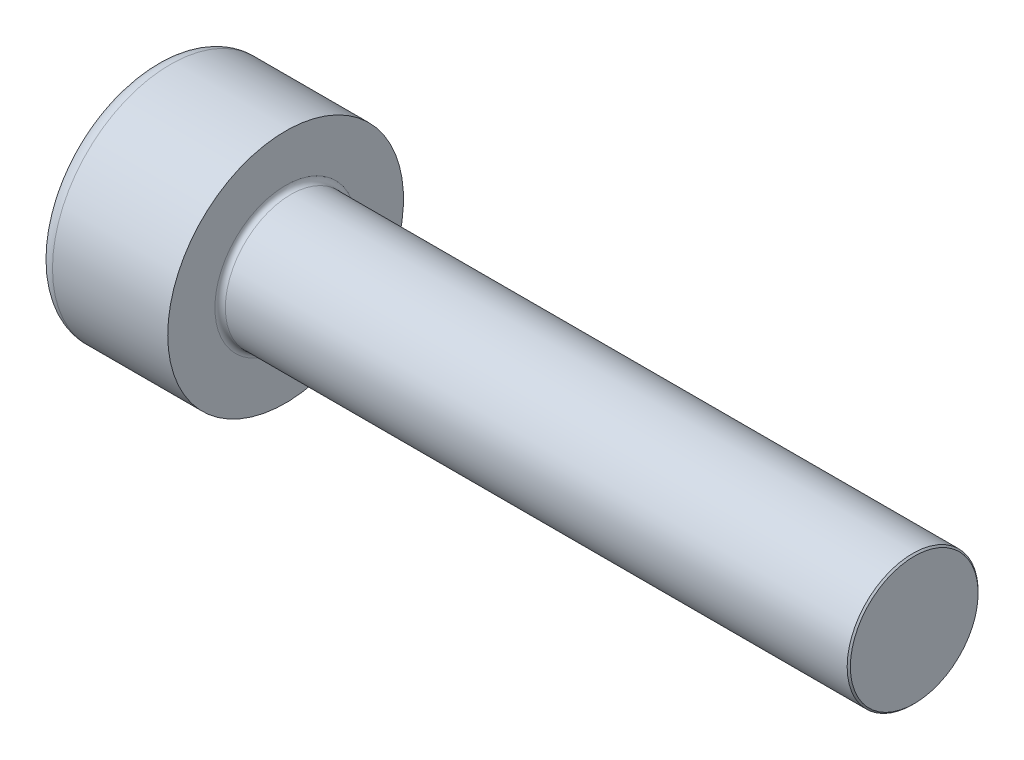
ISO-10303-21;
HEADER;
FILE_DESCRIPTION(('STEP AP214'),'2;1');
FILE_NAME('part.step','',(''),(''),'','','');
FILE_SCHEMA(('AUTOMOTIVE_DESIGN { 1 0 10303 214 1 1 1 1 }'));
ENDSEC;
DATA;
#1=APPLICATION_CONTEXT('core data for automotive mechanical design processes');
#2=APPLICATION_PROTOCOL_DEFINITION('international standard','automotive_design',2000,#1);
#3=PRODUCT_CONTEXT('',#1,'mechanical');
#4=PRODUCT('Part','Part','',(#3));
#5=PRODUCT_RELATED_PRODUCT_CATEGORY('part','',(#4));
#6=PRODUCT_DEFINITION_FORMATION('','',#4);
#7=PRODUCT_DEFINITION_CONTEXT('part definition',#1,'design');
#8=PRODUCT_DEFINITION('design','',#6,#7);
#9=PRODUCT_DEFINITION_SHAPE('','',#8);
#10=(LENGTH_UNIT() NAMED_UNIT(*) SI_UNIT(.MILLI.,.METRE.));
#11=(NAMED_UNIT(*) PLANE_ANGLE_UNIT() SI_UNIT($,.RADIAN.));
#12=(NAMED_UNIT(*) SI_UNIT($,.STERADIAN.) SOLID_ANGLE_UNIT());
#13=UNCERTAINTY_MEASURE_WITH_UNIT(LENGTH_MEASURE(1.E-05),#10,'distance_accuracy_value','');
#14=(GEOMETRIC_REPRESENTATION_CONTEXT(3) GLOBAL_UNCERTAINTY_ASSIGNED_CONTEXT((#13)) GLOBAL_UNIT_ASSIGNED_CONTEXT((#10,
#11,#12)) REPRESENTATION_CONTEXT('',''));
#15=CARTESIAN_POINT('',(0.,0.,0.));
#16=DIRECTION('',(0.,0.,1.));
#17=DIRECTION('',(1.,0.,0.));
#18=AXIS2_PLACEMENT_3D('',#15,#16,#17);
#19=CARTESIAN_POINT('',(0.,0.,0.));
#20=DIRECTION('',(-1.,0.,0.));
#21=DIRECTION('',(0.,0.,1.));
#22=AXIS2_PLACEMENT_3D('',#19,#20,#21);
#23=PLANE('',#22);
#24=DIRECTION('',(0.,-0.499999999999999,0.866025403784439));
#25=VECTOR('',#24,1.);
#26=CARTESIAN_POINT('',(0.,1.15470053837925,0.));
#27=LINE('',#26,#25);
#28=CARTESIAN_POINT('',(0.,1.15470053837925,0.));
#29=VERTEX_POINT('',#28);
#30=CARTESIAN_POINT('',(0.,0.577350269189622,0.999999999999997));
#31=VERTEX_POINT('',#30);
#32=EDGE_CURVE('E265',#29,#31,#27,.T.);
#33=ORIENTED_EDGE('',*,*,#32,.T.);
#34=DIRECTION('',(0.,1.,0.));
#35=VECTOR('',#34,1.);
#36=CARTESIAN_POINT('',(0.,-0.57735026918963,0.999999999999999));
#37=LINE('',#36,#35);
#38=CARTESIAN_POINT('',(0.,-0.57735026918963,0.999999999999999));
#39=VERTEX_POINT('',#38);
#40=EDGE_CURVE('E137',#39,#31,#37,.T.);
#41=ORIENTED_EDGE('',*,*,#40,.F.);
#42=DIRECTION('',(0.,-0.500000000000001,-0.866025403784438));
#43=VECTOR('',#42,1.);
#44=CARTESIAN_POINT('',(0.,-0.57735026918963,0.999999999999999));
#45=LINE('',#44,#43);
#46=CARTESIAN_POINT('',(0.,-1.15470053837926,0.));
#47=VERTEX_POINT('',#46);
#48=EDGE_CURVE('E268',#39,#47,#45,.T.);
#49=ORIENTED_EDGE('',*,*,#48,.T.);
#50=DIRECTION('',(0.,0.499999999999999,-0.866025403784439));
#51=VECTOR('',#50,1.);
#52=CARTESIAN_POINT('',(0.,-1.15470053837926,0.));
#53=LINE('',#52,#51);
#54=CARTESIAN_POINT('',(0.,-0.577350269189632,-1.));
#55=VERTEX_POINT('',#54);
#56=EDGE_CURVE('E271',#47,#55,#53,.T.);
#57=ORIENTED_EDGE('',*,*,#56,.T.);
#58=DIRECTION('',(0.,-1.,0.));
#59=VECTOR('',#58,1.);
#60=CARTESIAN_POINT('',(0.,0.577350269189619,-1.));
#61=LINE('',#60,#59);
#62=CARTESIAN_POINT('',(0.,0.577350269189619,-1.));
#63=VERTEX_POINT('',#62);
#64=EDGE_CURVE('E274',#63,#55,#61,.T.);
#65=ORIENTED_EDGE('',*,*,#64,.F.);
#66=DIRECTION('',(0.,-0.500000000000001,-0.866025403784438));
#67=VECTOR('',#66,1.);
#68=CARTESIAN_POINT('',(0.,1.15470053837925,0.));
#69=LINE('',#68,#67);
#70=EDGE_CURVE('E132',#29,#63,#69,.T.);
#71=ORIENTED_EDGE('',*,*,#70,.F.);
#72=EDGE_LOOP('',(#33,#41,#49,#57,#65,#71));
#73=FACE_BOUND('',#72,.T.);
#74=CARTESIAN_POINT('',(0.,0.,0.));
#75=DIRECTION('',(-1.,0.,0.));
#76=DIRECTION('',(0.,0.,1.));
#77=AXIS2_PLACEMENT_3D('',#74,#75,#76);
#78=CIRCLE('',#77,1.95);
#79=CARTESIAN_POINT('',(0.,0.,1.95));
#80=VERTEX_POINT('',#79);
#81=EDGE_CURVE('E49',#80,#80,#78,.T.);
#82=ORIENTED_EDGE('',*,*,#81,.T.);
#83=EDGE_LOOP('',(#82));
#84=FACE_BOUND('',#83,.T.);
#85=ADVANCED_FACE('F41',(#73,#84),#23,.T.);
#86=CARTESIAN_POINT('',(-31.75,0.,0.));
#87=DIRECTION('',(-1.,0.,0.));
#88=DIRECTION('',(0.,0.,1.));
#89=AXIS2_PLACEMENT_3D('',#86,#87,#88);
#90=CYLINDRICAL_SURFACE('',#89,2.25);
#91=CARTESIAN_POINT('',(0.300000000000002,0.,0.));
#92=DIRECTION('',(-1.,0.,0.));
#93=DIRECTION('',(0.,0.,1.));
#94=AXIS2_PLACEMENT_3D('',#91,#92,#93);
#95=CIRCLE('',#94,2.25);
#96=CARTESIAN_POINT('',(0.300000000000002,0.,2.25));
#97=VERTEX_POINT('',#96);
#98=EDGE_CURVE('E11',#97,#97,#95,.F.);
#99=ORIENTED_EDGE('',*,*,#98,.T.);
#100=EDGE_LOOP('',(#99));
#101=FACE_BOUND('',#100,.T.);
#102=CARTESIAN_POINT('',(2.5,0.,0.));
#103=DIRECTION('',(-1.,0.,0.));
#104=DIRECTION('',(0.,0.,1.));
#105=AXIS2_PLACEMENT_3D('',#102,#103,#104);
#106=CIRCLE('',#105,2.25);
#107=CARTESIAN_POINT('',(2.5,0.,2.25));
#108=VERTEX_POINT('',#107);
#109=EDGE_CURVE('E155',#108,#108,#106,.T.);
#110=ORIENTED_EDGE('',*,*,#109,.T.);
#111=EDGE_LOOP('',(#110));
#112=FACE_BOUND('',#111,.T.);
#113=ADVANCED_FACE('F180',(#101,#112),#90,.T.);
#114=CARTESIAN_POINT('',(2.5,2.25,0.));
#115=DIRECTION('',(1.,0.,0.));
#116=DIRECTION('',(0.,0.,-1.));
#117=AXIS2_PLACEMENT_3D('',#114,#115,#116);
#118=PLANE('',#117);
#119=CARTESIAN_POINT('',(2.5,0.,0.));
#120=DIRECTION('',(1.,0.,0.));
#121=DIRECTION('',(0.,0.,-1.));
#122=AXIS2_PLACEMENT_3D('',#119,#120,#121);
#123=CIRCLE('',#122,1.34999999999999);
#124=CARTESIAN_POINT('',(2.5,0.,-1.34999999999999));
#125=VERTEX_POINT('',#124);
#126=EDGE_CURVE('E158',#125,#125,#123,.F.);
#127=ORIENTED_EDGE('',*,*,#126,.T.);
#128=EDGE_LOOP('',(#127));
#129=FACE_BOUND('',#128,.T.);
#130=ORIENTED_EDGE('',*,*,#109,.F.);
#131=EDGE_LOOP('',(#130));
#132=FACE_BOUND('',#131,.T.);
#133=ADVANCED_FACE('F185',(#129,#132),#118,.T.);
#134=CARTESIAN_POINT('',(-31.75,0.,0.));
#135=DIRECTION('',(-1.,0.,0.));
#136=DIRECTION('',(0.,0.,1.));
#137=AXIS2_PLACEMENT_3D('',#134,#135,#136);
#138=CYLINDRICAL_SURFACE('',#137,1.24999999999999);
#139=CARTESIAN_POINT('',(2.6,0.,0.));
#140=DIRECTION('',(1.,0.,0.));
#141=DIRECTION('',(0.,0.,-1.));
#142=AXIS2_PLACEMENT_3D('',#139,#140,#141);
#143=CIRCLE('',#142,1.24999999999999);
#144=CARTESIAN_POINT('',(2.6,0.,-1.24999999999999));
#145=VERTEX_POINT('',#144);
#146=EDGE_CURVE('E161',#145,#145,#143,.T.);
#147=ORIENTED_EDGE('',*,*,#146,.T.);
#148=EDGE_LOOP('',(#147));
#149=FACE_BOUND('',#148,.T.);
#150=CARTESIAN_POINT('',(14.4695,0.,0.));
#151=DIRECTION('',(-1.,0.,0.));
#152=DIRECTION('',(0.,0.,1.));
#153=AXIS2_PLACEMENT_3D('',#150,#151,#152);
#154=CIRCLE('',#153,1.24999999999998);
#155=CARTESIAN_POINT('',(14.4695,0.,1.24999999999998));
#156=VERTEX_POINT('',#155);
#157=EDGE_CURVE('E152',#156,#156,#154,.T.);
#158=ORIENTED_EDGE('',*,*,#157,.T.);
#159=EDGE_LOOP('',(#158));
#160=FACE_BOUND('',#159,.T.);
#161=ADVANCED_FACE('F191',(#149,#160),#138,.T.);
#162=CARTESIAN_POINT('',(14.5,0.,0.));
#163=DIRECTION('',(-1.,0.,0.));
#164=DIRECTION('',(0.,0.,1.));
#165=AXIS2_PLACEMENT_3D('',#162,#163,#164);
#166=CONICAL_SURFACE('',#165,1.2195,0.785398163396688);
#167=ORIENTED_EDGE('',*,*,#157,.F.);
#168=EDGE_LOOP('',(#167));
#169=FACE_BOUND('',#168,.T.);
#170=CARTESIAN_POINT('',(14.5,0.,0.));
#171=DIRECTION('',(-1.,0.,0.));
#172=DIRECTION('',(0.,0.,1.));
#173=AXIS2_PLACEMENT_3D('',#170,#171,#172);
#174=CIRCLE('',#173,1.2195);
#175=CARTESIAN_POINT('',(14.5,0.,1.2195));
#176=VERTEX_POINT('',#175);
#177=EDGE_CURVE('E148',#176,#176,#174,.T.);
#178=ORIENTED_EDGE('',*,*,#177,.T.);
#179=EDGE_LOOP('',(#178));
#180=FACE_BOUND('',#179,.T.);
#181=ADVANCED_FACE('F195',(#169,#180),#166,.T.);
#182=CARTESIAN_POINT('',(14.5,1.2195,0.));
#183=DIRECTION('',(1.,0.,0.));
#184=DIRECTION('',(0.,0.,-1.));
#185=AXIS2_PLACEMENT_3D('',#182,#183,#184);
#186=PLANE('',#185);
#187=ORIENTED_EDGE('',*,*,#177,.F.);
#188=EDGE_LOOP('',(#187));
#189=FACE_BOUND('',#188,.T.);
#190=ADVANCED_FACE('F177',(#189),#186,.T.);
#191=CARTESIAN_POINT('',(2.6,0.,0.));
#192=DIRECTION('',(1.,0.,0.));
#193=DIRECTION('',(0.,0.,-1.));
#194=AXIS2_PLACEMENT_3D('',#191,#192,#193);
#195=TOROIDAL_SURFACE('',#194,1.34999999999999,0.1);
#196=ORIENTED_EDGE('',*,*,#146,.F.);
#197=EDGE_LOOP('',(#196));
#198=FACE_BOUND('',#197,.T.);
#199=ORIENTED_EDGE('',*,*,#126,.F.);
#200=EDGE_LOOP('',(#199));
#201=FACE_BOUND('',#200,.T.);
#202=ADVANCED_FACE('F168',(#198,#201),#195,.F.);
#203=CARTESIAN_POINT('',(0.300000000000002,0.,0.));
#204=DIRECTION('',(-1.,0.,0.));
#205=DIRECTION('',(0.,0.,1.));
#206=AXIS2_PLACEMENT_3D('',#203,#204,#205);
#207=TOROIDAL_SURFACE('',#206,1.95,0.3);
#208=ORIENTED_EDGE('',*,*,#98,.F.);
#209=EDGE_LOOP('',(#208));
#210=FACE_BOUND('',#209,.T.);
#211=ORIENTED_EDGE('',*,*,#81,.F.);
#212=EDGE_LOOP('',(#211));
#213=FACE_BOUND('',#212,.T.);
#214=ADVANCED_FACE('F43',(#210,#213),#207,.T.);
#215=CARTESIAN_POINT('',(1.3,1.15470053837925,0.));
#216=DIRECTION('',(0.,-0.866025403784439,-0.499999999999999));
#217=DIRECTION('',(0.,0.499999999999999,-0.866025403784439));
#218=AXIS2_PLACEMENT_3D('',#215,#216,#217);
#219=PLANE('',#218);
#220=ORIENTED_EDGE('',*,*,#32,.F.);
#221=DIRECTION('',(-1.,0.,0.));
#222=VECTOR('',#221,1.);
#223=CARTESIAN_POINT('',(1.3,1.15470053837925,0.));
#224=LINE('',#223,#222);
#225=CARTESIAN_POINT('',(1.3,1.15470053837925,0.));
#226=VERTEX_POINT('',#225);
#227=EDGE_CURVE('E255',#226,#29,#224,.T.);
#228=ORIENTED_EDGE('',*,*,#227,.F.);
#229=DIRECTION('',(0.,-0.499999999999999,0.866025403784439));
#230=VECTOR('',#229,1.);
#231=CARTESIAN_POINT('',(1.3,1.15470053837925,0.));
#232=LINE('',#231,#230);
#233=CARTESIAN_POINT('',(1.3,0.866025403784435,0.499999999999997));
#234=VERTEX_POINT('',#233);
#235=EDGE_CURVE('E124',#226,#234,#232,.T.);
#236=ORIENTED_EDGE('',*,*,#235,.T.);
#237=CARTESIAN_POINT('',(1.3,0.577350269189622,0.999999999999997));
#238=VERTEX_POINT('',#237);
#239=EDGE_CURVE('E115',#234,#238,#232,.T.);
#240=ORIENTED_EDGE('',*,*,#239,.T.);
#241=DIRECTION('',(-1.,0.,0.));
#242=VECTOR('',#241,1.);
#243=CARTESIAN_POINT('',(1.3,0.577350269189622,0.999999999999997));
#244=LINE('',#243,#242);
#245=EDGE_CURVE('E129',#238,#31,#244,.T.);
#246=ORIENTED_EDGE('',*,*,#245,.T.);
#247=EDGE_LOOP('',(#220,#228,#236,#240,#246));
#248=FACE_BOUND('',#247,.T.);
#249=ADVANCED_FACE('F128',(#248),#219,.T.);
#250=CARTESIAN_POINT('',(1.3,-0.57735026918963,0.999999999999999));
#251=DIRECTION('',(0.,0.,1.));
#252=DIRECTION('',(0.,-1.,0.));
#253=AXIS2_PLACEMENT_3D('',#250,#251,#252);
#254=PLANE('',#253);
#255=ORIENTED_EDGE('',*,*,#40,.T.);
#256=ORIENTED_EDGE('',*,*,#245,.F.);
#257=DIRECTION('',(0.,1.,0.));
#258=VECTOR('',#257,1.);
#259=CARTESIAN_POINT('',(1.3,-0.57735026918963,0.999999999999999));
#260=LINE('',#259,#258);
#261=CARTESIAN_POINT('',(1.3,0.,0.999999999999998));
#262=VERTEX_POINT('',#261);
#263=EDGE_CURVE('E112',#262,#238,#260,.T.);
#264=ORIENTED_EDGE('',*,*,#263,.F.);
#265=CARTESIAN_POINT('',(1.3,-0.57735026918963,0.999999999999999));
#266=VERTEX_POINT('',#265);
#267=EDGE_CURVE('E123',#266,#262,#260,.T.);
#268=ORIENTED_EDGE('',*,*,#267,.F.);
#269=DIRECTION('',(-1.,0.,0.));
#270=VECTOR('',#269,1.);
#271=CARTESIAN_POINT('',(1.3,-0.57735026918963,0.999999999999999));
#272=LINE('',#271,#270);
#273=EDGE_CURVE('E139',#266,#39,#272,.T.);
#274=ORIENTED_EDGE('',*,*,#273,.T.);
#275=EDGE_LOOP('',(#255,#256,#264,#268,#274));
#276=FACE_BOUND('',#275,.T.);
#277=ADVANCED_FACE('F134',(#276),#254,.F.);
#278=CARTESIAN_POINT('',(1.3,-0.57735026918963,0.999999999999999));
#279=DIRECTION('',(0.,0.866025403784438,-0.500000000000001));
#280=DIRECTION('',(0.,0.500000000000001,0.866025403784438));
#281=AXIS2_PLACEMENT_3D('',#278,#279,#280);
#282=PLANE('',#281);
#283=ORIENTED_EDGE('',*,*,#48,.F.);
#284=ORIENTED_EDGE('',*,*,#273,.F.);
#285=DIRECTION('',(0.,-0.500000000000001,-0.866025403784438));
#286=VECTOR('',#285,1.);
#287=CARTESIAN_POINT('',(1.3,-0.57735026918963,0.999999999999999));
#288=LINE('',#287,#286);
#289=CARTESIAN_POINT('',(1.3,-0.866025403784441,0.500000000000003));
#290=VERTEX_POINT('',#289);
#291=EDGE_CURVE('E294',#266,#290,#288,.T.);
#292=ORIENTED_EDGE('',*,*,#291,.T.);
#293=CARTESIAN_POINT('',(1.3,-1.15470053837926,0.));
#294=VERTEX_POINT('',#293);
#295=EDGE_CURVE('E283',#290,#294,#288,.T.);
#296=ORIENTED_EDGE('',*,*,#295,.T.);
#297=DIRECTION('',(-1.,0.,0.));
#298=VECTOR('',#297,1.);
#299=CARTESIAN_POINT('',(1.3,-1.15470053837926,0.));
#300=LINE('',#299,#298);
#301=EDGE_CURVE('E144',#294,#47,#300,.T.);
#302=ORIENTED_EDGE('',*,*,#301,.T.);
#303=EDGE_LOOP('',(#283,#284,#292,#296,#302));
#304=FACE_BOUND('',#303,.T.);
#305=ADVANCED_FACE('F209',(#304),#282,.T.);
#306=CARTESIAN_POINT('',(1.3,-1.15470053837926,0.));
#307=DIRECTION('',(0.,0.866025403784439,0.499999999999999));
#308=DIRECTION('',(0.,-0.499999999999999,0.866025403784439));
#309=AXIS2_PLACEMENT_3D('',#306,#307,#308);
#310=PLANE('',#309);
#311=ORIENTED_EDGE('',*,*,#56,.F.);
#312=ORIENTED_EDGE('',*,*,#301,.F.);
#313=DIRECTION('',(0.,0.499999999999999,-0.866025403784439));
#314=VECTOR('',#313,1.);
#315=CARTESIAN_POINT('',(1.3,-1.15470053837926,0.));
#316=LINE('',#315,#314);
#317=CARTESIAN_POINT('',(1.3,-0.866025403784444,-0.500000000000002));
#318=VERTEX_POINT('',#317);
#319=EDGE_CURVE('E261',#294,#318,#316,.T.);
#320=ORIENTED_EDGE('',*,*,#319,.T.);
#321=CARTESIAN_POINT('',(1.3,-0.577350269189632,-1.));
#322=VERTEX_POINT('',#321);
#323=EDGE_CURVE('E293',#318,#322,#316,.T.);
#324=ORIENTED_EDGE('',*,*,#323,.T.);
#325=DIRECTION('',(-1.,0.,0.));
#326=VECTOR('',#325,1.);
#327=CARTESIAN_POINT('',(1.3,-0.577350269189632,-1.));
#328=LINE('',#327,#326);
#329=EDGE_CURVE('E254',#322,#55,#328,.T.);
#330=ORIENTED_EDGE('',*,*,#329,.T.);
#331=EDGE_LOOP('',(#311,#312,#320,#324,#330));
#332=FACE_BOUND('',#331,.T.);
#333=ADVANCED_FACE('F212',(#332),#310,.T.);
#334=CARTESIAN_POINT('',(1.3,0.577350269189619,-1.));
#335=DIRECTION('',(0.,0.,-1.));
#336=DIRECTION('',(0.,1.,0.));
#337=AXIS2_PLACEMENT_3D('',#334,#335,#336);
#338=PLANE('',#337);
#339=ORIENTED_EDGE('',*,*,#64,.T.);
#340=ORIENTED_EDGE('',*,*,#329,.F.);
#341=DIRECTION('',(0.,-1.,0.));
#342=VECTOR('',#341,1.);
#343=CARTESIAN_POINT('',(1.3,0.577350269189619,-1.));
#344=LINE('',#343,#342);
#345=CARTESIAN_POINT('',(1.3,0.,-1.));
#346=VERTEX_POINT('',#345);
#347=EDGE_CURVE('E258',#346,#322,#344,.T.);
#348=ORIENTED_EDGE('',*,*,#347,.F.);
#349=CARTESIAN_POINT('',(1.3,0.577350269189619,-1.));
#350=VERTEX_POINT('',#349);
#351=EDGE_CURVE('E56',#350,#346,#344,.T.);
#352=ORIENTED_EDGE('',*,*,#351,.F.);
#353=DIRECTION('',(-1.,0.,0.));
#354=VECTOR('',#353,1.);
#355=CARTESIAN_POINT('',(1.3,0.577350269189619,-1.));
#356=LINE('',#355,#354);
#357=EDGE_CURVE('E251',#350,#63,#356,.T.);
#358=ORIENTED_EDGE('',*,*,#357,.T.);
#359=EDGE_LOOP('',(#339,#340,#348,#352,#358));
#360=FACE_BOUND('',#359,.T.);
#361=ADVANCED_FACE('F216',(#360),#338,.F.);
#362=CARTESIAN_POINT('',(1.3,1.15470053837925,0.));
#363=DIRECTION('',(0.,0.866025403784438,-0.500000000000001));
#364=DIRECTION('',(0.,0.500000000000001,0.866025403784438));
#365=AXIS2_PLACEMENT_3D('',#362,#363,#364);
#366=PLANE('',#365);
#367=ORIENTED_EDGE('',*,*,#70,.T.);
#368=ORIENTED_EDGE('',*,*,#357,.F.);
#369=DIRECTION('',(0.,-0.500000000000001,-0.866025403784438));
#370=VECTOR('',#369,1.);
#371=CARTESIAN_POINT('',(1.3,1.15470053837925,0.));
#372=LINE('',#371,#370);
#373=CARTESIAN_POINT('',(1.3,0.866025403784435,-0.5));
#374=VERTEX_POINT('',#373);
#375=EDGE_CURVE('E241',#374,#350,#372,.T.);
#376=ORIENTED_EDGE('',*,*,#375,.F.);
#377=EDGE_CURVE('E247',#226,#374,#372,.T.);
#378=ORIENTED_EDGE('',*,*,#377,.F.);
#379=ORIENTED_EDGE('',*,*,#227,.T.);
#380=EDGE_LOOP('',(#367,#368,#376,#378,#379));
#381=FACE_BOUND('',#380,.T.);
#382=ADVANCED_FACE('F220',(#381),#366,.F.);
#383=CARTESIAN_POINT('',(1.3,1.15470053837925,0.));
#384=DIRECTION('',(1.,0.,0.));
#385=DIRECTION('',(0.,0.,-1.));
#386=AXIS2_PLACEMENT_3D('',#383,#384,#385);
#387=PLANE('',#386);
#388=ORIENTED_EDGE('',*,*,#347,.T.);
#389=ORIENTED_EDGE('',*,*,#323,.F.);
#390=CARTESIAN_POINT('',(1.3,0.,0.));
#391=DIRECTION('',(-1.,0.,0.));
#392=DIRECTION('',(0.,0.,1.));
#393=AXIS2_PLACEMENT_3D('',#390,#391,#392);
#394=CIRCLE('',#393,1.);
#395=EDGE_CURVE('E289',#346,#318,#394,.T.);
#396=ORIENTED_EDGE('',*,*,#395,.F.);
#397=EDGE_LOOP('',(#388,#389,#396));
#398=FACE_BOUND('',#397,.T.);
#399=ADVANCED_FACE('F224',(#398),#387,.F.);
#400=ORIENTED_EDGE('',*,*,#319,.F.);
#401=ORIENTED_EDGE('',*,*,#295,.F.);
#402=EDGE_CURVE('E142',#318,#290,#394,.T.);
#403=ORIENTED_EDGE('',*,*,#402,.F.);
#404=EDGE_LOOP('',(#400,#401,#403));
#405=FACE_BOUND('',#404,.T.);
#406=ADVANCED_FACE('F227',(#405),#387,.F.);
#407=ORIENTED_EDGE('',*,*,#291,.F.);
#408=ORIENTED_EDGE('',*,*,#267,.T.);
#409=EDGE_CURVE('E138',#290,#262,#394,.T.);
#410=ORIENTED_EDGE('',*,*,#409,.F.);
#411=EDGE_LOOP('',(#407,#408,#410));
#412=FACE_BOUND('',#411,.T.);
#413=ADVANCED_FACE('F232',(#412),#387,.F.);
#414=ORIENTED_EDGE('',*,*,#263,.T.);
#415=ORIENTED_EDGE('',*,*,#239,.F.);
#416=EDGE_CURVE('E118',#262,#234,#394,.T.);
#417=ORIENTED_EDGE('',*,*,#416,.F.);
#418=EDGE_LOOP('',(#414,#415,#417));
#419=FACE_BOUND('',#418,.T.);
#420=ADVANCED_FACE('F114',(#419),#387,.F.);
#421=ORIENTED_EDGE('',*,*,#235,.F.);
#422=ORIENTED_EDGE('',*,*,#377,.T.);
#423=EDGE_CURVE('E149',#234,#374,#394,.T.);
#424=ORIENTED_EDGE('',*,*,#423,.F.);
#425=EDGE_LOOP('',(#421,#422,#424));
#426=FACE_BOUND('',#425,.T.);
#427=ADVANCED_FACE('F235',(#426),#387,.F.);
#428=ORIENTED_EDGE('',*,*,#375,.T.);
#429=ORIENTED_EDGE('',*,*,#351,.T.);
#430=EDGE_CURVE('E244',#374,#346,#394,.T.);
#431=ORIENTED_EDGE('',*,*,#430,.F.);
#432=EDGE_LOOP('',(#428,#429,#431));
#433=FACE_BOUND('',#432,.T.);
#434=ADVANCED_FACE('F205',(#433),#387,.F.);
#435=CARTESIAN_POINT('',(1.3,0.,0.));
#436=DIRECTION('',(-1.,0.,0.));
#437=DIRECTION('',(0.,0.,1.));
#438=AXIS2_PLACEMENT_3D('',#435,#436,#437);
#439=CONICAL_SURFACE('',#438,1.,1.04719755119659);
#440=CARTESIAN_POINT('',(1.87735026918964,0.,0.));
#441=VERTEX_POINT('',#440);
#442=VERTEX_LOOP('',#441);
#443=FACE_BOUND('',#442,.T.);
#444=ORIENTED_EDGE('',*,*,#416,.T.);
#445=ORIENTED_EDGE('',*,*,#423,.T.);
#446=ORIENTED_EDGE('',*,*,#430,.T.);
#447=ORIENTED_EDGE('',*,*,#395,.T.);
#448=ORIENTED_EDGE('',*,*,#402,.T.);
#449=ORIENTED_EDGE('',*,*,#409,.T.);
#450=EDGE_LOOP('',(#444,#445,#446,#447,#448,#449));
#451=FACE_BOUND('',#450,.T.);
#452=ADVANCED_FACE('F203',(#443,#451),#439,.F.);
#453=CLOSED_SHELL('',(#85,#113,#133,#161,#181,#190,#202,#214,#249,#277,#305,#333,#361,#382,#399,
#406,#413,#420,#427,#434,#452));
#454=MANIFOLD_SOLID_BREP('B2',#453);
#455=ADVANCED_BREP_SHAPE_REPRESENTATION('',(#18,#454),#14);
#456=SHAPE_DEFINITION_REPRESENTATION(#9,#455);
ENDSEC;
END-ISO-10303-21;
